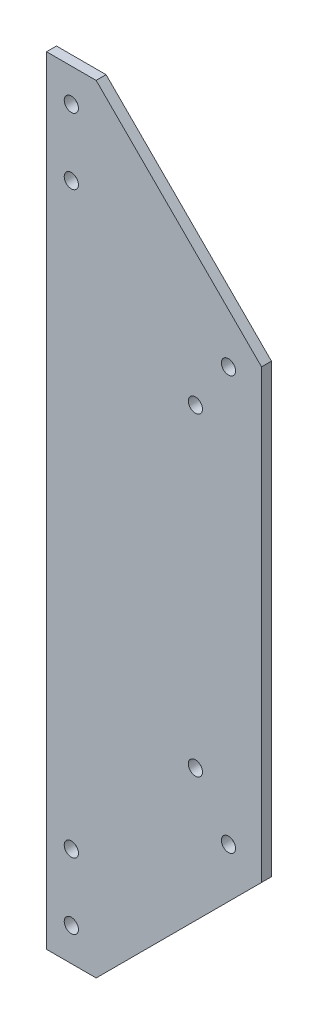
ISO-10303-21;
HEADER;
FILE_DESCRIPTION(('STEP AP214'),'2;1');
FILE_NAME('part.step','',(''),(''),'','','');
FILE_SCHEMA(('AUTOMOTIVE_DESIGN { 1 0 10303 214 1 1 1 1 }'));
ENDSEC;
DATA;
#1=APPLICATION_CONTEXT('core data for automotive mechanical design processes');
#2=APPLICATION_PROTOCOL_DEFINITION('international standard','automotive_design',2000,#1);
#3=PRODUCT_CONTEXT('',#1,'mechanical');
#4=PRODUCT('Part','Part','',(#3));
#5=PRODUCT_RELATED_PRODUCT_CATEGORY('part','',(#4));
#6=PRODUCT_DEFINITION_FORMATION('','',#4);
#7=PRODUCT_DEFINITION_CONTEXT('part definition',#1,'design');
#8=PRODUCT_DEFINITION('design','',#6,#7);
#9=PRODUCT_DEFINITION_SHAPE('','',#8);
#10=(LENGTH_UNIT() NAMED_UNIT(*) SI_UNIT(.MILLI.,.METRE.));
#11=(NAMED_UNIT(*) PLANE_ANGLE_UNIT() SI_UNIT($,.RADIAN.));
#12=(NAMED_UNIT(*) SI_UNIT($,.STERADIAN.) SOLID_ANGLE_UNIT());
#13=UNCERTAINTY_MEASURE_WITH_UNIT(LENGTH_MEASURE(1.E-05),#10,'distance_accuracy_value','');
#14=(GEOMETRIC_REPRESENTATION_CONTEXT(3) GLOBAL_UNCERTAINTY_ASSIGNED_CONTEXT((#13)) GLOBAL_UNIT_ASSIGNED_CONTEXT((#10,
#11,#12)) REPRESENTATION_CONTEXT('',''));
#15=CARTESIAN_POINT('',(0.,0.,0.));
#16=DIRECTION('',(0.,0.,1.));
#17=DIRECTION('',(1.,0.,0.));
#18=AXIS2_PLACEMENT_3D('',#15,#16,#17);
#19=CARTESIAN_POINT('',(-337.325085214601,117.499999999867,3.));
#20=DIRECTION('',(0.,-1.,0.));
#21=DIRECTION('',(0.,0.,-1.));
#22=AXIS2_PLACEMENT_3D('',#19,#20,#21);
#23=PLANE('',#22);
#24=DIRECTION('',(-1.,0.,0.));
#25=VECTOR('',#24,1.);
#26=CARTESIAN_POINT('',(-337.325085214601,117.499999999867,0.));
#27=LINE('',#26,#25);
#28=CARTESIAN_POINT('',(-337.325085214601,117.499999999867,0.));
#29=VERTEX_POINT('',#28);
#30=CARTESIAN_POINT('',(-352.325085214601,117.499999999867,0.));
#31=VERTEX_POINT('',#30);
#32=EDGE_CURVE('E118',#29,#31,#27,.T.);
#33=ORIENTED_EDGE('',*,*,#32,.T.);
#34=DIRECTION('',(0.,0.,-1.));
#35=VECTOR('',#34,1.);
#36=CARTESIAN_POINT('',(-352.325085214601,117.499999999867,3.));
#37=LINE('',#36,#35);
#38=CARTESIAN_POINT('',(-352.325085214601,117.499999999867,3.));
#39=VERTEX_POINT('',#38);
#40=EDGE_CURVE('E11',#39,#31,#37,.T.);
#41=ORIENTED_EDGE('',*,*,#40,.F.);
#42=DIRECTION('',(-1.,0.,0.));
#43=VECTOR('',#42,1.);
#44=CARTESIAN_POINT('',(-337.325085214601,117.499999999867,3.));
#45=LINE('',#44,#43);
#46=CARTESIAN_POINT('',(-337.325085214601,117.499999999867,3.));
#47=VERTEX_POINT('',#46);
#48=EDGE_CURVE('E129',#47,#39,#45,.T.);
#49=ORIENTED_EDGE('',*,*,#48,.F.);
#50=DIRECTION('',(0.,0.,-1.));
#51=VECTOR('',#50,1.);
#52=CARTESIAN_POINT('',(-337.325085214601,117.499999999867,3.));
#53=LINE('',#52,#51);
#54=EDGE_CURVE('E114',#47,#29,#53,.T.);
#55=ORIENTED_EDGE('',*,*,#54,.T.);
#56=EDGE_LOOP('',(#33,#41,#49,#55));
#57=FACE_BOUND('',#56,.T.);
#58=ADVANCED_FACE('F34',(#57),#23,.F.);
#59=CARTESIAN_POINT('',(-352.325085214601,117.499999999867,3.));
#60=DIRECTION('',(1.,0.,0.));
#61=DIRECTION('',(0.,0.,-1.));
#62=AXIS2_PLACEMENT_3D('',#59,#60,#61);
#63=PLANE('',#62);
#64=DIRECTION('',(0.,-1.,0.));
#65=VECTOR('',#64,1.);
#66=CARTESIAN_POINT('',(-352.325085214601,117.499999999867,0.));
#67=LINE('',#66,#65);
#68=CARTESIAN_POINT('',(-352.325085214601,-117.499999999972,0.));
#69=VERTEX_POINT('',#68);
#70=EDGE_CURVE('E121',#31,#69,#67,.T.);
#71=ORIENTED_EDGE('',*,*,#70,.T.);
#72=DIRECTION('',(0.,0.,-1.));
#73=VECTOR('',#72,1.);
#74=CARTESIAN_POINT('',(-352.325085214601,-117.499999999972,3.));
#75=LINE('',#74,#73);
#76=CARTESIAN_POINT('',(-352.325085214601,-117.499999999972,3.));
#77=VERTEX_POINT('',#76);
#78=EDGE_CURVE('E42',#77,#69,#75,.T.);
#79=ORIENTED_EDGE('',*,*,#78,.F.);
#80=DIRECTION('',(0.,-1.,0.));
#81=VECTOR('',#80,1.);
#82=CARTESIAN_POINT('',(-352.325085214601,117.499999999867,3.));
#83=LINE('',#82,#81);
#84=EDGE_CURVE('E87',#39,#77,#83,.T.);
#85=ORIENTED_EDGE('',*,*,#84,.F.);
#86=ORIENTED_EDGE('',*,*,#40,.T.);
#87=EDGE_LOOP('',(#71,#79,#85,#86));
#88=FACE_BOUND('',#87,.T.);
#89=ADVANCED_FACE('F154',(#88),#63,.F.);
#90=CARTESIAN_POINT('',(-352.325085214601,-117.499999999972,3.));
#91=DIRECTION('',(0.,1.,0.));
#92=DIRECTION('',(0.,0.,1.));
#93=AXIS2_PLACEMENT_3D('',#90,#91,#92);
#94=PLANE('',#93);
#95=DIRECTION('',(1.,0.,0.));
#96=VECTOR('',#95,1.);
#97=CARTESIAN_POINT('',(-352.325085214601,-117.499999999972,0.));
#98=LINE('',#97,#96);
#99=CARTESIAN_POINT('',(-337.325085214601,-117.499999999972,0.));
#100=VERTEX_POINT('',#99);
#101=EDGE_CURVE('E124',#69,#100,#98,.T.);
#102=ORIENTED_EDGE('',*,*,#101,.T.);
#103=DIRECTION('',(0.,0.,-1.));
#104=VECTOR('',#103,1.);
#105=CARTESIAN_POINT('',(-337.325085214601,-117.499999999972,3.));
#106=LINE('',#105,#104);
#107=CARTESIAN_POINT('',(-337.325085214601,-117.499999999972,3.));
#108=VERTEX_POINT('',#107);
#109=EDGE_CURVE('E109',#108,#100,#106,.T.);
#110=ORIENTED_EDGE('',*,*,#109,.F.);
#111=DIRECTION('',(1.,0.,0.));
#112=VECTOR('',#111,1.);
#113=CARTESIAN_POINT('',(-352.325085214601,-117.499999999972,3.));
#114=LINE('',#113,#112);
#115=EDGE_CURVE('E100',#77,#108,#114,.T.);
#116=ORIENTED_EDGE('',*,*,#115,.F.);
#117=ORIENTED_EDGE('',*,*,#78,.T.);
#118=EDGE_LOOP('',(#102,#110,#116,#117));
#119=FACE_BOUND('',#118,.T.);
#120=ADVANCED_FACE('F135',(#119),#94,.F.);
#121=CARTESIAN_POINT('',(-337.325085214601,-117.499999999972,3.));
#122=DIRECTION('',(-0.707106781186551,0.707106781186544,0.));
#123=DIRECTION('',(-0.707106781186544,-0.707106781186551,0.));
#124=AXIS2_PLACEMENT_3D('',#121,#122,#123);
#125=PLANE('',#124);
#126=DIRECTION('',(0.707106781186544,0.707106781186551,0.));
#127=VECTOR('',#126,1.);
#128=CARTESIAN_POINT('',(-337.325085214601,-117.499999999972,0.));
#129=LINE('',#128,#127);
#130=CARTESIAN_POINT('',(-287.325085214601,-67.4999999999718,0.));
#131=VERTEX_POINT('',#130);
#132=EDGE_CURVE('E108',#100,#131,#129,.T.);
#133=ORIENTED_EDGE('',*,*,#132,.T.);
#134=DIRECTION('',(0.,0.,-1.));
#135=VECTOR('',#134,1.);
#136=CARTESIAN_POINT('',(-287.325085214601,-67.4999999999718,3.));
#137=LINE('',#136,#135);
#138=CARTESIAN_POINT('',(-287.325085214601,-67.4999999999718,3.));
#139=VERTEX_POINT('',#138);
#140=EDGE_CURVE('E105',#139,#131,#137,.T.);
#141=ORIENTED_EDGE('',*,*,#140,.F.);
#142=DIRECTION('',(0.707106781186544,0.707106781186551,0.));
#143=VECTOR('',#142,1.);
#144=CARTESIAN_POINT('',(-337.325085214601,-117.499999999972,3.));
#145=LINE('',#144,#143);
#146=EDGE_CURVE('E94',#108,#139,#145,.T.);
#147=ORIENTED_EDGE('',*,*,#146,.F.);
#148=ORIENTED_EDGE('',*,*,#109,.T.);
#149=EDGE_LOOP('',(#133,#141,#147,#148));
#150=FACE_BOUND('',#149,.T.);
#151=ADVANCED_FACE('F106',(#150),#125,.F.);
#152=CARTESIAN_POINT('',(-287.325085214601,-67.4999999999718,3.));
#153=DIRECTION('',(-1.,0.,0.));
#154=DIRECTION('',(0.,-1.,0.));
#155=AXIS2_PLACEMENT_3D('',#152,#153,#154);
#156=PLANE('',#155);
#157=DIRECTION('',(0.,1.,0.));
#158=VECTOR('',#157,1.);
#159=CARTESIAN_POINT('',(-287.325085214601,-67.4999999999718,0.));
#160=LINE('',#159,#158);
#161=CARTESIAN_POINT('',(-287.325085214601,67.4999999998661,0.));
#162=VERTEX_POINT('',#161);
#163=EDGE_CURVE('E73',#131,#162,#160,.T.);
#164=ORIENTED_EDGE('',*,*,#163,.T.);
#165=DIRECTION('',(0.,0.,-1.));
#166=VECTOR('',#165,1.);
#167=CARTESIAN_POINT('',(-287.325085214601,67.4999999998661,3.));
#168=LINE('',#167,#166);
#169=CARTESIAN_POINT('',(-287.325085214601,67.4999999998661,3.));
#170=VERTEX_POINT('',#169);
#171=EDGE_CURVE('E110',#170,#162,#168,.T.);
#172=ORIENTED_EDGE('',*,*,#171,.F.);
#173=DIRECTION('',(0.,1.,0.));
#174=VECTOR('',#173,1.);
#175=CARTESIAN_POINT('',(-287.325085214601,-67.4999999999718,3.));
#176=LINE('',#175,#174);
#177=EDGE_CURVE('E98',#139,#170,#176,.T.);
#178=ORIENTED_EDGE('',*,*,#177,.F.);
#179=ORIENTED_EDGE('',*,*,#140,.T.);
#180=EDGE_LOOP('',(#164,#172,#178,#179));
#181=FACE_BOUND('',#180,.T.);
#182=ADVANCED_FACE('F112',(#181),#156,.F.);
#183=CARTESIAN_POINT('',(-287.325085214601,67.4999999998661,3.));
#184=DIRECTION('',(-0.707106781186551,-0.707106781186544,0.));
#185=DIRECTION('',(0.707106781186544,-0.707106781186551,0.));
#186=AXIS2_PLACEMENT_3D('',#183,#184,#185);
#187=PLANE('',#186);
#188=DIRECTION('',(-0.707106781186544,0.707106781186551,0.));
#189=VECTOR('',#188,1.);
#190=CARTESIAN_POINT('',(-287.325085214601,67.4999999998661,0.));
#191=LINE('',#190,#189);
#192=EDGE_CURVE('E79',#162,#29,#191,.T.);
#193=ORIENTED_EDGE('',*,*,#192,.T.);
#194=ORIENTED_EDGE('',*,*,#54,.F.);
#195=DIRECTION('',(-0.707106781186544,0.707106781186551,0.));
#196=VECTOR('',#195,1.);
#197=CARTESIAN_POINT('',(-287.325085214601,67.4999999998661,3.));
#198=LINE('',#197,#196);
#199=EDGE_CURVE('E50',#170,#47,#198,.T.);
#200=ORIENTED_EDGE('',*,*,#199,.F.);
#201=ORIENTED_EDGE('',*,*,#171,.T.);
#202=EDGE_LOOP('',(#193,#194,#200,#201));
#203=FACE_BOUND('',#202,.T.);
#204=ADVANCED_FACE('F142',(#203),#187,.F.);
#205=CARTESIAN_POINT('',(0.,0.,3.));
#206=DIRECTION('',(0.,0.,1.));
#207=DIRECTION('',(1.,0.,0.));
#208=AXIS2_PLACEMENT_3D('',#205,#206,#207);
#209=PLANE('',#208);
#210=CARTESIAN_POINT('',(-344.825085214601,107.499999999867,3.));
#211=DIRECTION('',(0.,0.,-1.));
#212=DIRECTION('',(-1.,0.,0.));
#213=AXIS2_PLACEMENT_3D('',#210,#211,#212);
#214=CIRCLE('',#213,2.14999999999996);
#215=CARTESIAN_POINT('',(-346.975085214601,107.499999999867,3.));
#216=VERTEX_POINT('',#215);
#217=EDGE_CURVE('E122',#216,#216,#214,.T.);
#218=ORIENTED_EDGE('',*,*,#217,.T.);
#219=EDGE_LOOP('',(#218));
#220=FACE_BOUND('',#219,.T.);
#221=CARTESIAN_POINT('',(-297.325085214601,-62.4999999998661,3.));
#222=DIRECTION('',(0.,0.,-1.));
#223=DIRECTION('',(1.,0.,0.));
#224=AXIS2_PLACEMENT_3D('',#221,#222,#223);
#225=CIRCLE('',#224,2.14999999999996);
#226=CARTESIAN_POINT('',(-295.175085214601,-62.4999999998661,3.));
#227=VERTEX_POINT('',#226);
#228=EDGE_CURVE('E300',#227,#227,#225,.T.);
#229=ORIENTED_EDGE('',*,*,#228,.T.);
#230=EDGE_LOOP('',(#229));
#231=FACE_BOUND('',#230,.T.);
#232=CARTESIAN_POINT('',(-307.325085214601,-47.4999999998661,3.));
#233=DIRECTION('',(0.,0.,-1.));
#234=DIRECTION('',(1.,0.,0.));
#235=AXIS2_PLACEMENT_3D('',#232,#233,#234);
#236=CIRCLE('',#235,2.14999999999996);
#237=CARTESIAN_POINT('',(-305.175085214601,-47.4999999998661,3.));
#238=VERTEX_POINT('',#237);
#239=EDGE_CURVE('E294',#238,#238,#236,.T.);
#240=ORIENTED_EDGE('',*,*,#239,.T.);
#241=EDGE_LOOP('',(#240));
#242=FACE_BOUND('',#241,.T.);
#243=CARTESIAN_POINT('',(-307.325085214601,47.4999999998661,3.));
#244=DIRECTION('',(0.,0.,-1.));
#245=DIRECTION('',(-1.,0.,0.));
#246=AXIS2_PLACEMENT_3D('',#243,#244,#245);
#247=CIRCLE('',#246,2.14999999999996);
#248=CARTESIAN_POINT('',(-309.475085214601,47.4999999998661,3.));
#249=VERTEX_POINT('',#248);
#250=EDGE_CURVE('E287',#249,#249,#247,.T.);
#251=ORIENTED_EDGE('',*,*,#250,.T.);
#252=EDGE_LOOP('',(#251));
#253=FACE_BOUND('',#252,.T.);
#254=CARTESIAN_POINT('',(-344.825085214601,87.4999999998667,3.));
#255=DIRECTION('',(0.,0.,-1.));
#256=DIRECTION('',(-1.,0.,0.));
#257=AXIS2_PLACEMENT_3D('',#254,#255,#256);
#258=CIRCLE('',#257,2.14999999999996);
#259=CARTESIAN_POINT('',(-346.975085214601,87.4999999998667,3.));
#260=VERTEX_POINT('',#259);
#261=EDGE_CURVE('E280',#260,#260,#258,.T.);
#262=ORIENTED_EDGE('',*,*,#261,.T.);
#263=EDGE_LOOP('',(#262));
#264=FACE_BOUND('',#263,.T.);
#265=CARTESIAN_POINT('',(-344.825085214601,-87.4999999998667,3.));
#266=DIRECTION('',(0.,0.,-1.));
#267=DIRECTION('',(1.,0.,0.));
#268=AXIS2_PLACEMENT_3D('',#265,#266,#267);
#269=CIRCLE('',#268,2.14999999999996);
#270=CARTESIAN_POINT('',(-342.675085214601,-87.4999999998667,3.));
#271=VERTEX_POINT('',#270);
#272=EDGE_CURVE('E320',#271,#271,#269,.T.);
#273=ORIENTED_EDGE('',*,*,#272,.T.);
#274=EDGE_LOOP('',(#273));
#275=FACE_BOUND('',#274,.T.);
#276=CARTESIAN_POINT('',(-344.825085214601,-107.499999999867,3.));
#277=DIRECTION('',(0.,0.,-1.));
#278=DIRECTION('',(1.,0.,0.));
#279=AXIS2_PLACEMENT_3D('',#276,#277,#278);
#280=CIRCLE('',#279,2.14999999999996);
#281=CARTESIAN_POINT('',(-342.675085214601,-107.499999999867,3.));
#282=VERTEX_POINT('',#281);
#283=EDGE_CURVE('E306',#282,#282,#280,.T.);
#284=ORIENTED_EDGE('',*,*,#283,.T.);
#285=EDGE_LOOP('',(#284));
#286=FACE_BOUND('',#285,.T.);
#287=CARTESIAN_POINT('',(-297.325085214601,62.4999999998661,3.));
#288=DIRECTION('',(0.,0.,-1.));
#289=DIRECTION('',(-1.,0.,0.));
#290=AXIS2_PLACEMENT_3D('',#287,#288,#289);
#291=CIRCLE('',#290,2.14999999999996);
#292=CARTESIAN_POINT('',(-299.475085214601,62.4999999998661,3.));
#293=VERTEX_POINT('',#292);
#294=EDGE_CURVE('E313',#293,#293,#291,.T.);
#295=ORIENTED_EDGE('',*,*,#294,.T.);
#296=EDGE_LOOP('',(#295));
#297=FACE_BOUND('',#296,.T.);
#298=ORIENTED_EDGE('',*,*,#48,.T.);
#299=ORIENTED_EDGE('',*,*,#84,.T.);
#300=ORIENTED_EDGE('',*,*,#115,.T.);
#301=ORIENTED_EDGE('',*,*,#146,.T.);
#302=ORIENTED_EDGE('',*,*,#177,.T.);
#303=ORIENTED_EDGE('',*,*,#199,.T.);
#304=EDGE_LOOP('',(#298,#299,#300,#301,#302,#303));
#305=FACE_BOUND('',#304,.T.);
#306=ADVANCED_FACE('F96',(#220,#231,#242,#253,#264,#275,#286,#297,#305),#209,.T.);
#307=CARTESIAN_POINT('',(0.,0.,0.));
#308=DIRECTION('',(0.,0.,1.));
#309=DIRECTION('',(1.,0.,0.));
#310=AXIS2_PLACEMENT_3D('',#307,#308,#309);
#311=PLANE('',#310);
#312=CARTESIAN_POINT('',(-344.825085214601,107.499999999867,0.));
#313=DIRECTION('',(0.,0.,-1.));
#314=DIRECTION('',(-1.,0.,0.));
#315=AXIS2_PLACEMENT_3D('',#312,#313,#314);
#316=CIRCLE('',#315,2.14999999999996);
#317=CARTESIAN_POINT('',(-346.975085214601,107.499999999867,0.));
#318=VERTEX_POINT('',#317);
#319=EDGE_CURVE('E279',#318,#318,#316,.T.);
#320=ORIENTED_EDGE('',*,*,#319,.F.);
#321=EDGE_LOOP('',(#320));
#322=FACE_BOUND('',#321,.T.);
#323=CARTESIAN_POINT('',(-297.325085214601,-62.4999999998661,0.));
#324=DIRECTION('',(0.,0.,-1.));
#325=DIRECTION('',(1.,0.,0.));
#326=AXIS2_PLACEMENT_3D('',#323,#324,#325);
#327=CIRCLE('',#326,2.14999999999996);
#328=CARTESIAN_POINT('',(-295.175085214601,-62.4999999998661,0.));
#329=VERTEX_POINT('',#328);
#330=EDGE_CURVE('E303',#329,#329,#327,.T.);
#331=ORIENTED_EDGE('',*,*,#330,.F.);
#332=EDGE_LOOP('',(#331));
#333=FACE_BOUND('',#332,.T.);
#334=CARTESIAN_POINT('',(-307.325085214601,-47.4999999998661,0.));
#335=DIRECTION('',(0.,0.,-1.));
#336=DIRECTION('',(1.,0.,0.));
#337=AXIS2_PLACEMENT_3D('',#334,#335,#336);
#338=CIRCLE('',#337,2.14999999999996);
#339=CARTESIAN_POINT('',(-305.175085214601,-47.4999999998661,0.));
#340=VERTEX_POINT('',#339);
#341=EDGE_CURVE('E297',#340,#340,#338,.T.);
#342=ORIENTED_EDGE('',*,*,#341,.F.);
#343=EDGE_LOOP('',(#342));
#344=FACE_BOUND('',#343,.T.);
#345=CARTESIAN_POINT('',(-307.325085214601,47.4999999998661,0.));
#346=DIRECTION('',(0.,0.,-1.));
#347=DIRECTION('',(-1.,0.,0.));
#348=AXIS2_PLACEMENT_3D('',#345,#346,#347);
#349=CIRCLE('',#348,2.14999999999996);
#350=CARTESIAN_POINT('',(-309.475085214601,47.4999999998661,0.));
#351=VERTEX_POINT('',#350);
#352=EDGE_CURVE('E291',#351,#351,#349,.T.);
#353=ORIENTED_EDGE('',*,*,#352,.F.);
#354=EDGE_LOOP('',(#353));
#355=FACE_BOUND('',#354,.T.);
#356=CARTESIAN_POINT('',(-344.825085214601,87.4999999998667,0.));
#357=DIRECTION('',(0.,0.,-1.));
#358=DIRECTION('',(-1.,0.,0.));
#359=AXIS2_PLACEMENT_3D('',#356,#357,#358);
#360=CIRCLE('',#359,2.14999999999996);
#361=CARTESIAN_POINT('',(-346.975085214601,87.4999999998667,0.));
#362=VERTEX_POINT('',#361);
#363=EDGE_CURVE('E284',#362,#362,#360,.T.);
#364=ORIENTED_EDGE('',*,*,#363,.F.);
#365=EDGE_LOOP('',(#364));
#366=FACE_BOUND('',#365,.T.);
#367=CARTESIAN_POINT('',(-344.825085214601,-87.4999999998667,0.));
#368=DIRECTION('',(0.,0.,-1.));
#369=DIRECTION('',(1.,0.,0.));
#370=AXIS2_PLACEMENT_3D('',#367,#368,#369);
#371=CIRCLE('',#370,2.14999999999996);
#372=CARTESIAN_POINT('',(-342.675085214601,-87.4999999998667,0.));
#373=VERTEX_POINT('',#372);
#374=EDGE_CURVE('E309',#373,#373,#371,.T.);
#375=ORIENTED_EDGE('',*,*,#374,.F.);
#376=EDGE_LOOP('',(#375));
#377=FACE_BOUND('',#376,.T.);
#378=CARTESIAN_POINT('',(-344.825085214601,-107.499999999867,0.));
#379=DIRECTION('',(0.,0.,-1.));
#380=DIRECTION('',(1.,0.,0.));
#381=AXIS2_PLACEMENT_3D('',#378,#379,#380);
#382=CIRCLE('',#381,2.14999999999996);
#383=CARTESIAN_POINT('',(-342.675085214601,-107.499999999867,0.));
#384=VERTEX_POINT('',#383);
#385=EDGE_CURVE('E310',#384,#384,#382,.T.);
#386=ORIENTED_EDGE('',*,*,#385,.F.);
#387=EDGE_LOOP('',(#386));
#388=FACE_BOUND('',#387,.T.);
#389=CARTESIAN_POINT('',(-297.325085214601,62.4999999998661,0.));
#390=DIRECTION('',(0.,0.,-1.));
#391=DIRECTION('',(-1.,0.,0.));
#392=AXIS2_PLACEMENT_3D('',#389,#390,#391);
#393=CIRCLE('',#392,2.14999999999996);
#394=CARTESIAN_POINT('',(-299.475085214601,62.4999999998661,0.));
#395=VERTEX_POINT('',#394);
#396=EDGE_CURVE('E290',#395,#395,#393,.T.);
#397=ORIENTED_EDGE('',*,*,#396,.F.);
#398=EDGE_LOOP('',(#397));
#399=FACE_BOUND('',#398,.T.);
#400=ORIENTED_EDGE('',*,*,#32,.F.);
#401=ORIENTED_EDGE('',*,*,#192,.F.);
#402=ORIENTED_EDGE('',*,*,#163,.F.);
#403=ORIENTED_EDGE('',*,*,#132,.F.);
#404=ORIENTED_EDGE('',*,*,#101,.F.);
#405=ORIENTED_EDGE('',*,*,#70,.F.);
#406=EDGE_LOOP('',(#400,#401,#402,#403,#404,#405));
#407=FACE_BOUND('',#406,.T.);
#408=ADVANCED_FACE('F138',(#322,#333,#344,#355,#366,#377,#388,#399,#407),#311,.F.);
#409=CARTESIAN_POINT('',(-297.325085214601,62.4999999998661,3.));
#410=DIRECTION('',(0.,0.,-1.));
#411=DIRECTION('',(-1.,0.,0.));
#412=AXIS2_PLACEMENT_3D('',#409,#410,#411);
#413=CYLINDRICAL_SURFACE('',#412,2.14999999999996);
#414=ORIENTED_EDGE('',*,*,#294,.F.);
#415=EDGE_LOOP('',(#414));
#416=FACE_BOUND('',#415,.T.);
#417=ORIENTED_EDGE('',*,*,#396,.T.);
#418=EDGE_LOOP('',(#417));
#419=FACE_BOUND('',#418,.T.);
#420=ADVANCED_FACE('F191',(#416,#419),#413,.F.);
#421=CARTESIAN_POINT('',(-344.825085214601,-107.499999999867,3.));
#422=DIRECTION('',(0.,0.,-1.));
#423=DIRECTION('',(-1.,0.,0.));
#424=AXIS2_PLACEMENT_3D('',#421,#422,#423);
#425=CYLINDRICAL_SURFACE('',#424,2.14999999999996);
#426=ORIENTED_EDGE('',*,*,#283,.F.);
#427=EDGE_LOOP('',(#426));
#428=FACE_BOUND('',#427,.T.);
#429=ORIENTED_EDGE('',*,*,#385,.T.);
#430=EDGE_LOOP('',(#429));
#431=FACE_BOUND('',#430,.T.);
#432=ADVANCED_FACE('F200',(#428,#431),#425,.F.);
#433=CARTESIAN_POINT('',(-344.825085214601,-87.4999999998667,3.));
#434=DIRECTION('',(0.,0.,-1.));
#435=DIRECTION('',(-1.,0.,0.));
#436=AXIS2_PLACEMENT_3D('',#433,#434,#435);
#437=CYLINDRICAL_SURFACE('',#436,2.14999999999996);
#438=ORIENTED_EDGE('',*,*,#272,.F.);
#439=EDGE_LOOP('',(#438));
#440=FACE_BOUND('',#439,.T.);
#441=ORIENTED_EDGE('',*,*,#374,.T.);
#442=EDGE_LOOP('',(#441));
#443=FACE_BOUND('',#442,.T.);
#444=ADVANCED_FACE('F210',(#440,#443),#437,.F.);
#445=CARTESIAN_POINT('',(-344.825085214601,87.4999999998667,3.));
#446=DIRECTION('',(0.,0.,-1.));
#447=DIRECTION('',(-1.,0.,0.));
#448=AXIS2_PLACEMENT_3D('',#445,#446,#447);
#449=CYLINDRICAL_SURFACE('',#448,2.14999999999996);
#450=ORIENTED_EDGE('',*,*,#261,.F.);
#451=EDGE_LOOP('',(#450));
#452=FACE_BOUND('',#451,.T.);
#453=ORIENTED_EDGE('',*,*,#363,.T.);
#454=EDGE_LOOP('',(#453));
#455=FACE_BOUND('',#454,.T.);
#456=ADVANCED_FACE('F220',(#452,#455),#449,.F.);
#457=CARTESIAN_POINT('',(-307.325085214601,47.4999999998661,3.));
#458=DIRECTION('',(0.,0.,-1.));
#459=DIRECTION('',(-1.,0.,0.));
#460=AXIS2_PLACEMENT_3D('',#457,#458,#459);
#461=CYLINDRICAL_SURFACE('',#460,2.14999999999996);
#462=ORIENTED_EDGE('',*,*,#250,.F.);
#463=EDGE_LOOP('',(#462));
#464=FACE_BOUND('',#463,.T.);
#465=ORIENTED_EDGE('',*,*,#352,.T.);
#466=EDGE_LOOP('',(#465));
#467=FACE_BOUND('',#466,.T.);
#468=ADVANCED_FACE('F230',(#464,#467),#461,.F.);
#469=CARTESIAN_POINT('',(-307.325085214601,-47.4999999998661,3.));
#470=DIRECTION('',(0.,0.,-1.));
#471=DIRECTION('',(-1.,0.,0.));
#472=AXIS2_PLACEMENT_3D('',#469,#470,#471);
#473=CYLINDRICAL_SURFACE('',#472,2.14999999999996);
#474=ORIENTED_EDGE('',*,*,#239,.F.);
#475=EDGE_LOOP('',(#474));
#476=FACE_BOUND('',#475,.T.);
#477=ORIENTED_EDGE('',*,*,#341,.T.);
#478=EDGE_LOOP('',(#477));
#479=FACE_BOUND('',#478,.T.);
#480=ADVANCED_FACE('F240',(#476,#479),#473,.F.);
#481=CARTESIAN_POINT('',(-297.325085214601,-62.4999999998661,3.));
#482=DIRECTION('',(0.,0.,-1.));
#483=DIRECTION('',(-1.,0.,0.));
#484=AXIS2_PLACEMENT_3D('',#481,#482,#483);
#485=CYLINDRICAL_SURFACE('',#484,2.14999999999996);
#486=ORIENTED_EDGE('',*,*,#228,.F.);
#487=EDGE_LOOP('',(#486));
#488=FACE_BOUND('',#487,.T.);
#489=ORIENTED_EDGE('',*,*,#330,.T.);
#490=EDGE_LOOP('',(#489));
#491=FACE_BOUND('',#490,.T.);
#492=ADVANCED_FACE('F250',(#488,#491),#485,.F.);
#493=CARTESIAN_POINT('',(-344.825085214601,107.499999999867,3.));
#494=DIRECTION('',(0.,0.,-1.));
#495=DIRECTION('',(-1.,0.,0.));
#496=AXIS2_PLACEMENT_3D('',#493,#494,#495);
#497=CYLINDRICAL_SURFACE('',#496,2.14999999999996);
#498=ORIENTED_EDGE('',*,*,#217,.F.);
#499=EDGE_LOOP('',(#498));
#500=FACE_BOUND('',#499,.T.);
#501=ORIENTED_EDGE('',*,*,#319,.T.);
#502=EDGE_LOOP('',(#501));
#503=FACE_BOUND('',#502,.T.);
#504=ADVANCED_FACE('F260',(#500,#503),#497,.F.);
#505=CLOSED_SHELL('',(#58,#89,#120,#151,#182,#204,#306,#408,#420,#432,#444,#456,#468,#480,#492,#504));
#506=MANIFOLD_SOLID_BREP('B2',#505);
#507=ADVANCED_BREP_SHAPE_REPRESENTATION('',(#18,#506),#14);
#508=SHAPE_DEFINITION_REPRESENTATION(#9,#507);
ENDSEC;
END-ISO-10303-21;
